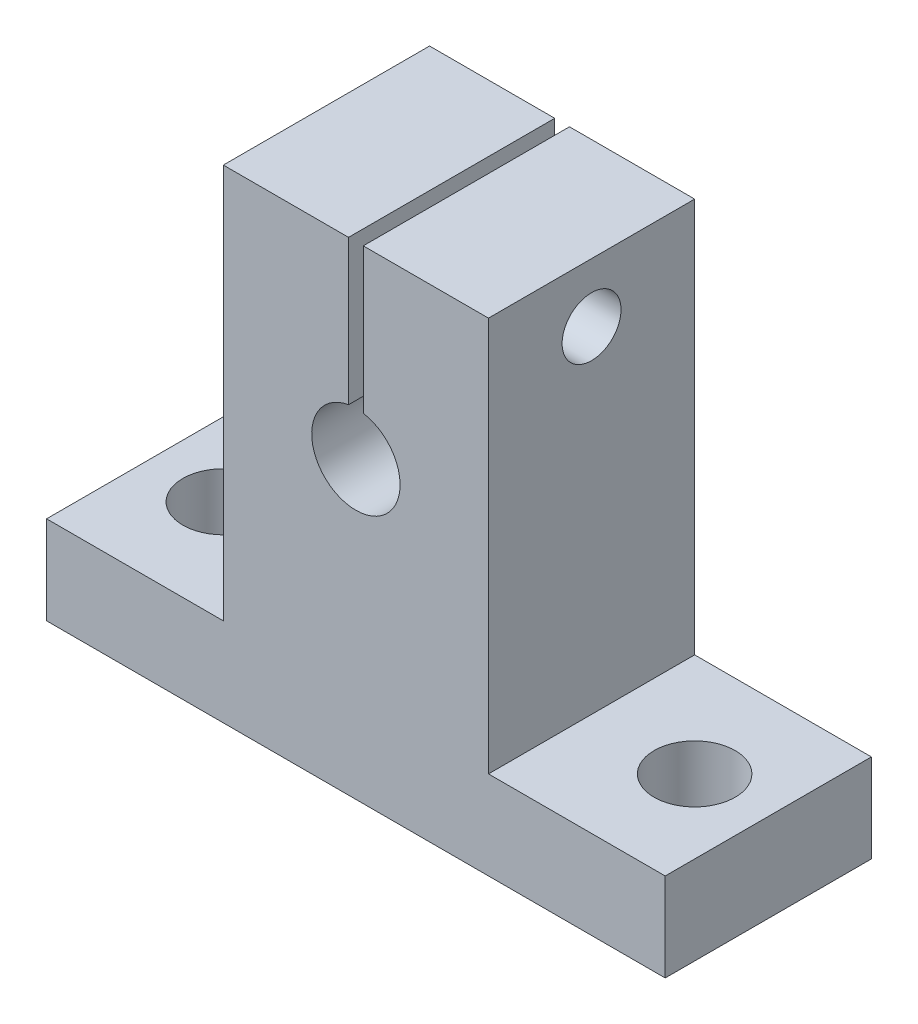
ISO-10303-21;
HEADER;
FILE_DESCRIPTION(('STEP AP214'),'2;1');
FILE_NAME('part.step','',(''),(''),'','','');
FILE_SCHEMA(('AUTOMOTIVE_DESIGN { 1 0 10303 214 1 1 1 1 }'));
ENDSEC;
DATA;
#1=APPLICATION_CONTEXT('core data for automotive mechanical design processes');
#2=APPLICATION_PROTOCOL_DEFINITION('international standard','automotive_design',2000,#1);
#3=PRODUCT_CONTEXT('',#1,'mechanical');
#4=PRODUCT('Part','Part','',(#3));
#5=PRODUCT_RELATED_PRODUCT_CATEGORY('part','',(#4));
#6=PRODUCT_DEFINITION_FORMATION('','',#4);
#7=PRODUCT_DEFINITION_CONTEXT('part definition',#1,'design');
#8=PRODUCT_DEFINITION('design','',#6,#7);
#9=PRODUCT_DEFINITION_SHAPE('','',#8);
#10=(LENGTH_UNIT() NAMED_UNIT(*) SI_UNIT(.MILLI.,.METRE.));
#11=(NAMED_UNIT(*) PLANE_ANGLE_UNIT() SI_UNIT($,.RADIAN.));
#12=(NAMED_UNIT(*) SI_UNIT($,.STERADIAN.) SOLID_ANGLE_UNIT());
#13=UNCERTAINTY_MEASURE_WITH_UNIT(LENGTH_MEASURE(1.E-05),#10,'distance_accuracy_value','');
#14=(GEOMETRIC_REPRESENTATION_CONTEXT(3) GLOBAL_UNCERTAINTY_ASSIGNED_CONTEXT((#13)) GLOBAL_UNIT_ASSIGNED_CONTEXT((#10,
#11,#12)) REPRESENTATION_CONTEXT('',''));
#15=CARTESIAN_POINT('',(0.,0.,0.));
#16=DIRECTION('',(0.,0.,1.));
#17=DIRECTION('',(1.,0.,0.));
#18=AXIS2_PLACEMENT_3D('',#15,#16,#17);
#19=CARTESIAN_POINT('',(-22.,28.8,7.));
#20=DIRECTION('',(1.,0.,0.));
#21=DIRECTION('',(0.,0.,-1.));
#22=AXIS2_PLACEMENT_3D('',#19,#20,#21);
#23=CYLINDRICAL_SURFACE('',#22,2.);
#24=CARTESIAN_POINT('',(0.5,28.8,7.));
#25=DIRECTION('',(1.,0.,0.));
#26=DIRECTION('',(0.,0.,-1.));
#27=AXIS2_PLACEMENT_3D('',#24,#25,#26);
#28=CIRCLE('',#27,2.);
#29=CARTESIAN_POINT('',(0.5,28.8,5.));
#30=VERTEX_POINT('',#29);
#31=EDGE_CURVE('E114',#30,#30,#28,.T.);
#32=ORIENTED_EDGE('',*,*,#31,.F.);
#33=EDGE_LOOP('',(#32));
#34=FACE_BOUND('',#33,.T.);
#35=CARTESIAN_POINT('',(9.00000000000001,28.8,7.));
#36=DIRECTION('',(1.,0.,0.));
#37=DIRECTION('',(0.,0.,-1.));
#38=AXIS2_PLACEMENT_3D('',#35,#36,#37);
#39=CIRCLE('',#38,2.);
#40=CARTESIAN_POINT('',(9.00000000000001,28.8,5.));
#41=VERTEX_POINT('',#40);
#42=EDGE_CURVE('E181',#41,#41,#39,.T.);
#43=ORIENTED_EDGE('',*,*,#42,.T.);
#44=EDGE_LOOP('',(#43));
#45=FACE_BOUND('',#44,.T.);
#46=ADVANCED_FACE('F17',(#34,#45),#23,.F.);
#47=CARTESIAN_POINT('',(16.,-16.,7.));
#48=DIRECTION('',(0.,1.,0.));
#49=DIRECTION('',(-1.,0.,0.));
#50=AXIS2_PLACEMENT_3D('',#47,#48,#49);
#51=CYLINDRICAL_SURFACE('',#50,2.75);
#52=CARTESIAN_POINT('',(16.,0.,7.));
#53=DIRECTION('',(0.,1.,0.));
#54=DIRECTION('',(-1.,0.,0.));
#55=AXIS2_PLACEMENT_3D('',#52,#53,#54);
#56=CIRCLE('',#55,2.75);
#57=CARTESIAN_POINT('',(13.25,0.,7.));
#58=VERTEX_POINT('',#57);
#59=EDGE_CURVE('E200',#58,#58,#56,.F.);
#60=ORIENTED_EDGE('',*,*,#59,.T.);
#61=EDGE_LOOP('',(#60));
#62=FACE_BOUND('',#61,.T.);
#63=CARTESIAN_POINT('',(16.,6.00000000000001,7.));
#64=DIRECTION('',(0.,1.,0.));
#65=DIRECTION('',(-1.,0.,0.));
#66=AXIS2_PLACEMENT_3D('',#63,#64,#65);
#67=CIRCLE('',#66,2.75);
#68=CARTESIAN_POINT('',(13.25,6.,7.));
#69=VERTEX_POINT('',#68);
#70=EDGE_CURVE('E175',#69,#69,#67,.T.);
#71=ORIENTED_EDGE('',*,*,#70,.T.);
#72=EDGE_LOOP('',(#71));
#73=FACE_BOUND('',#72,.T.);
#74=ADVANCED_FACE('F467',(#62,#73),#51,.F.);
#75=CARTESIAN_POINT('',(-16.,-16.,6.99999999999999));
#76=DIRECTION('',(0.,1.,0.));
#77=DIRECTION('',(-1.,0.,0.));
#78=AXIS2_PLACEMENT_3D('',#75,#76,#77);
#79=CYLINDRICAL_SURFACE('',#78,2.75);
#80=CARTESIAN_POINT('',(-16.,0.,6.99999999999999));
#81=DIRECTION('',(0.,1.,0.));
#82=DIRECTION('',(-1.,0.,0.));
#83=AXIS2_PLACEMENT_3D('',#80,#81,#82);
#84=CIRCLE('',#83,2.75);
#85=CARTESIAN_POINT('',(-18.75,0.,6.99999999999999));
#86=VERTEX_POINT('',#85);
#87=EDGE_CURVE('E164',#86,#86,#84,.F.);
#88=ORIENTED_EDGE('',*,*,#87,.T.);
#89=EDGE_LOOP('',(#88));
#90=FACE_BOUND('',#89,.T.);
#91=CARTESIAN_POINT('',(-16.,6.,6.99999999999999));
#92=DIRECTION('',(0.,1.,0.));
#93=DIRECTION('',(-1.,0.,0.));
#94=AXIS2_PLACEMENT_3D('',#91,#92,#93);
#95=CIRCLE('',#94,2.75);
#96=CARTESIAN_POINT('',(-18.75,6.,6.99999999999999));
#97=VERTEX_POINT('',#96);
#98=EDGE_CURVE('E153',#97,#97,#95,.T.);
#99=ORIENTED_EDGE('',*,*,#98,.T.);
#100=EDGE_LOOP('',(#99));
#101=FACE_BOUND('',#100,.T.);
#102=ADVANCED_FACE('F458',(#90,#101),#79,.F.);
#103=CARTESIAN_POINT('',(-22.,28.8,7.));
#104=DIRECTION('',(1.,0.,0.));
#105=DIRECTION('',(0.,0.,-1.));
#106=AXIS2_PLACEMENT_3D('',#103,#104,#105);
#107=CYLINDRICAL_SURFACE('',#106,2.);
#108=CARTESIAN_POINT('',(-0.5,28.8,7.));
#109=DIRECTION('',(1.,0.,0.));
#110=DIRECTION('',(0.,0.,-1.));
#111=AXIS2_PLACEMENT_3D('',#108,#109,#110);
#112=CIRCLE('',#111,2.);
#113=CARTESIAN_POINT('',(-0.5,28.8,5.));
#114=VERTEX_POINT('',#113);
#115=EDGE_CURVE('E136',#114,#114,#112,.T.);
#116=ORIENTED_EDGE('',*,*,#115,.T.);
#117=EDGE_LOOP('',(#116));
#118=FACE_BOUND('',#117,.T.);
#119=CARTESIAN_POINT('',(-9.00000000000001,28.8,7.));
#120=DIRECTION('',(1.,0.,0.));
#121=DIRECTION('',(0.,0.,-1.));
#122=AXIS2_PLACEMENT_3D('',#119,#120,#121);
#123=CIRCLE('',#122,2.);
#124=CARTESIAN_POINT('',(-9.00000000000001,28.8,5.));
#125=VERTEX_POINT('',#124);
#126=EDGE_CURVE('E147',#125,#125,#123,.F.);
#127=ORIENTED_EDGE('',*,*,#126,.T.);
#128=EDGE_LOOP('',(#127));
#129=FACE_BOUND('',#128,.T.);
#130=ADVANCED_FACE('F450',(#118,#129),#107,.F.);
#131=CARTESIAN_POINT('',(0.,0.,14.));
#132=DIRECTION('',(0.,0.,-1.));
#133=DIRECTION('',(-1.,0.,0.));
#134=AXIS2_PLACEMENT_3D('',#131,#132,#133);
#135=PLANE('',#134);
#136=CARTESIAN_POINT('',(0.,20.,14.));
#137=DIRECTION('',(0.,0.,-1.));
#138=DIRECTION('',(-1.,0.,0.));
#139=AXIS2_PLACEMENT_3D('',#136,#137,#138);
#140=CIRCLE('',#139,3.);
#141=CARTESIAN_POINT('',(0.500000000000001,22.9580398915498,14.));
#142=VERTEX_POINT('',#141);
#143=CARTESIAN_POINT('',(-0.499999999999999,22.9580398915498,14.));
#144=VERTEX_POINT('',#143);
#145=EDGE_CURVE('E20',#142,#144,#140,.T.);
#146=ORIENTED_EDGE('',*,*,#145,.T.);
#147=DIRECTION('',(0.,-1.,0.));
#148=VECTOR('',#147,1.);
#149=CARTESIAN_POINT('',(-0.5,32.8,14.));
#150=LINE('',#149,#148);
#151=CARTESIAN_POINT('',(-0.5,32.8,14.));
#152=VERTEX_POINT('',#151);
#153=EDGE_CURVE('E140',#144,#152,#150,.F.);
#154=ORIENTED_EDGE('',*,*,#153,.T.);
#155=DIRECTION('',(1.,0.,0.));
#156=VECTOR('',#155,1.);
#157=CARTESIAN_POINT('',(-9.00000000000001,32.8,14.));
#158=LINE('',#157,#156);
#159=CARTESIAN_POINT('',(-9.00000000000001,32.8,14.));
#160=VERTEX_POINT('',#159);
#161=EDGE_CURVE('E133',#152,#160,#158,.F.);
#162=ORIENTED_EDGE('',*,*,#161,.T.);
#163=DIRECTION('',(0.,1.,0.));
#164=VECTOR('',#163,1.);
#165=CARTESIAN_POINT('',(-9.,6.,14.));
#166=LINE('',#165,#164);
#167=CARTESIAN_POINT('',(-9.,6.,14.));
#168=VERTEX_POINT('',#167);
#169=EDGE_CURVE('E144',#160,#168,#166,.F.);
#170=ORIENTED_EDGE('',*,*,#169,.T.);
#171=DIRECTION('',(1.,0.,0.));
#172=VECTOR('',#171,1.);
#173=CARTESIAN_POINT('',(-21.,6.,14.));
#174=LINE('',#173,#172);
#175=CARTESIAN_POINT('',(-21.,6.,14.));
#176=VERTEX_POINT('',#175);
#177=EDGE_CURVE('E150',#168,#176,#174,.F.);
#178=ORIENTED_EDGE('',*,*,#177,.T.);
#179=DIRECTION('',(0.,1.,0.));
#180=VECTOR('',#179,1.);
#181=CARTESIAN_POINT('',(-21.,0.,14.));
#182=LINE('',#181,#180);
#183=CARTESIAN_POINT('',(-21.,0.,14.));
#184=VERTEX_POINT('',#183);
#185=EDGE_CURVE('E156',#176,#184,#182,.F.);
#186=ORIENTED_EDGE('',*,*,#185,.T.);
#187=DIRECTION('',(-1.,0.,0.));
#188=VECTOR('',#187,1.);
#189=CARTESIAN_POINT('',(-21.,0.,14.));
#190=LINE('',#189,#188);
#191=CARTESIAN_POINT('',(21.,0.,14.));
#192=VERTEX_POINT('',#191);
#193=EDGE_CURVE('E162',#184,#192,#190,.F.);
#194=ORIENTED_EDGE('',*,*,#193,.T.);
#195=DIRECTION('',(0.,1.,0.));
#196=VECTOR('',#195,1.);
#197=CARTESIAN_POINT('',(21.,0.,14.));
#198=LINE('',#197,#196);
#199=CARTESIAN_POINT('',(21.,6.00000000000001,14.));
#200=VERTEX_POINT('',#199);
#201=EDGE_CURVE('E167',#192,#200,#198,.T.);
#202=ORIENTED_EDGE('',*,*,#201,.T.);
#203=DIRECTION('',(1.,0.,0.));
#204=VECTOR('',#203,1.);
#205=CARTESIAN_POINT('',(9.,6.,14.));
#206=LINE('',#205,#204);
#207=CARTESIAN_POINT('',(9.,6.,14.));
#208=VERTEX_POINT('',#207);
#209=EDGE_CURVE('E173',#200,#208,#206,.F.);
#210=ORIENTED_EDGE('',*,*,#209,.T.);
#211=DIRECTION('',(0.,1.,0.));
#212=VECTOR('',#211,1.);
#213=CARTESIAN_POINT('',(9.,6.,14.));
#214=LINE('',#213,#212);
#215=CARTESIAN_POINT('',(9.,32.8,14.));
#216=VERTEX_POINT('',#215);
#217=EDGE_CURVE('E178',#208,#216,#214,.T.);
#218=ORIENTED_EDGE('',*,*,#217,.T.);
#219=DIRECTION('',(1.,0.,0.));
#220=VECTOR('',#219,1.);
#221=CARTESIAN_POINT('',(-9.00000000000001,32.8,14.));
#222=LINE('',#221,#220);
#223=CARTESIAN_POINT('',(0.5,32.8,14.));
#224=VERTEX_POINT('',#223);
#225=EDGE_CURVE('E119',#216,#224,#222,.F.);
#226=ORIENTED_EDGE('',*,*,#225,.T.);
#227=DIRECTION('',(0.,-1.,0.));
#228=VECTOR('',#227,1.);
#229=CARTESIAN_POINT('',(0.5,32.8,14.));
#230=LINE('',#229,#228);
#231=EDGE_CURVE('E116',#142,#224,#230,.F.);
#232=ORIENTED_EDGE('',*,*,#231,.F.);
#233=EDGE_LOOP('',(#146,#154,#162,#170,#178,#186,#194,#202,#210,#218,#226,#232));
#234=FACE_BOUND('',#233,.T.);
#235=ADVANCED_FACE('F117',(#234),#135,.F.);
#236=CARTESIAN_POINT('',(0.,20.,14.));
#237=DIRECTION('',(0.,0.,-1.));
#238=DIRECTION('',(-1.,0.,0.));
#239=AXIS2_PLACEMENT_3D('',#236,#237,#238);
#240=CYLINDRICAL_SURFACE('',#239,3.);
#241=ORIENTED_EDGE('',*,*,#145,.F.);
#242=DIRECTION('',(0.,0.,1.));
#243=VECTOR('',#242,1.);
#244=CARTESIAN_POINT('',(0.500000000000001,22.9580398915498,-5.));
#245=LINE('',#244,#243);
#246=CARTESIAN_POINT('',(0.500000000000001,22.9580398915498,0.));
#247=VERTEX_POINT('',#246);
#248=EDGE_CURVE('E108',#247,#142,#245,.T.);
#249=ORIENTED_EDGE('',*,*,#248,.F.);
#250=CARTESIAN_POINT('',(0.,20.,0.));
#251=DIRECTION('',(0.,0.,-1.));
#252=DIRECTION('',(-1.,0.,0.));
#253=AXIS2_PLACEMENT_3D('',#250,#251,#252);
#254=CIRCLE('',#253,3.);
#255=CARTESIAN_POINT('',(-0.499999999999999,22.9580398915498,0.));
#256=VERTEX_POINT('',#255);
#257=EDGE_CURVE('E190',#256,#247,#254,.F.);
#258=ORIENTED_EDGE('',*,*,#257,.F.);
#259=DIRECTION('',(0.,0.,1.));
#260=VECTOR('',#259,1.);
#261=CARTESIAN_POINT('',(-0.499999999999999,22.9580398915498,-5.));
#262=LINE('',#261,#260);
#263=EDGE_CURVE('E111',#256,#144,#262,.T.);
#264=ORIENTED_EDGE('',*,*,#263,.T.);
#265=EDGE_LOOP('',(#241,#249,#258,#264));
#266=FACE_BOUND('',#265,.T.);
#267=ADVANCED_FACE('F106',(#266),#240,.F.);
#268=CARTESIAN_POINT('',(0.5,32.8,-5.));
#269=DIRECTION('',(-1.,0.,0.));
#270=DIRECTION('',(0.,-1.,0.));
#271=AXIS2_PLACEMENT_3D('',#268,#269,#270);
#272=PLANE('',#271);
#273=DIRECTION('',(0.,0.,-1.));
#274=VECTOR('',#273,1.);
#275=CARTESIAN_POINT('',(0.5,32.8,14.));
#276=LINE('',#275,#274);
#277=CARTESIAN_POINT('',(0.500000000000001,32.8,0.));
#278=VERTEX_POINT('',#277);
#279=EDGE_CURVE('E185',#224,#278,#276,.T.);
#280=ORIENTED_EDGE('',*,*,#279,.T.);
#281=DIRECTION('',(0.,1.,0.));
#282=VECTOR('',#281,1.);
#283=CARTESIAN_POINT('',(0.500000000000001,0.,0.));
#284=LINE('',#283,#282);
#285=EDGE_CURVE('E126',#247,#278,#284,.T.);
#286=ORIENTED_EDGE('',*,*,#285,.F.);
#287=ORIENTED_EDGE('',*,*,#248,.T.);
#288=ORIENTED_EDGE('',*,*,#231,.T.);
#289=EDGE_LOOP('',(#280,#286,#287,#288));
#290=FACE_BOUND('',#289,.T.);
#291=ORIENTED_EDGE('',*,*,#31,.T.);
#292=EDGE_LOOP('',(#291));
#293=FACE_BOUND('',#292,.T.);
#294=ADVANCED_FACE('F123',(#290,#293),#272,.T.);
#295=CARTESIAN_POINT('',(-9.00000000000001,32.8,14.));
#296=DIRECTION('',(0.,-1.,0.));
#297=DIRECTION('',(0.,0.,-1.));
#298=AXIS2_PLACEMENT_3D('',#295,#296,#297);
#299=PLANE('',#298);
#300=ORIENTED_EDGE('',*,*,#225,.F.);
#301=DIRECTION('',(0.,0.,1.));
#302=VECTOR('',#301,1.);
#303=CARTESIAN_POINT('',(9.,32.8,14.));
#304=LINE('',#303,#302);
#305=CARTESIAN_POINT('',(9.,32.8,0.));
#306=VERTEX_POINT('',#305);
#307=EDGE_CURVE('E180',#216,#306,#304,.F.);
#308=ORIENTED_EDGE('',*,*,#307,.T.);
#309=DIRECTION('',(-1.,0.,0.));
#310=VECTOR('',#309,1.);
#311=CARTESIAN_POINT('',(0.,32.8,0.));
#312=LINE('',#311,#310);
#313=EDGE_CURVE('E212',#278,#306,#312,.F.);
#314=ORIENTED_EDGE('',*,*,#313,.F.);
#315=ORIENTED_EDGE('',*,*,#279,.F.);
#316=EDGE_LOOP('',(#300,#308,#314,#315));
#317=FACE_BOUND('',#316,.T.);
#318=ADVANCED_FACE('F333',(#317),#299,.F.);
#319=CARTESIAN_POINT('',(9.,6.,14.));
#320=DIRECTION('',(-1.,0.,0.));
#321=DIRECTION('',(0.,0.,1.));
#322=AXIS2_PLACEMENT_3D('',#319,#320,#321);
#323=PLANE('',#322);
#324=ORIENTED_EDGE('',*,*,#307,.F.);
#325=ORIENTED_EDGE('',*,*,#217,.F.);
#326=DIRECTION('',(0.,0.,1.));
#327=VECTOR('',#326,1.);
#328=CARTESIAN_POINT('',(9.,6.,14.));
#329=LINE('',#328,#327);
#330=CARTESIAN_POINT('',(9.,6.,0.));
#331=VERTEX_POINT('',#330);
#332=EDGE_CURVE('E170',#208,#331,#329,.F.);
#333=ORIENTED_EDGE('',*,*,#332,.T.);
#334=DIRECTION('',(0.,1.,0.));
#335=VECTOR('',#334,1.);
#336=CARTESIAN_POINT('',(9.,0.,0.));
#337=LINE('',#336,#335);
#338=EDGE_CURVE('E215',#306,#331,#337,.F.);
#339=ORIENTED_EDGE('',*,*,#338,.F.);
#340=EDGE_LOOP('',(#324,#325,#333,#339));
#341=FACE_BOUND('',#340,.T.);
#342=ORIENTED_EDGE('',*,*,#42,.F.);
#343=EDGE_LOOP('',(#342));
#344=FACE_BOUND('',#343,.T.);
#345=ADVANCED_FACE('F330',(#341,#344),#323,.F.);
#346=CARTESIAN_POINT('',(9.,6.,14.));
#347=DIRECTION('',(0.,-1.,0.));
#348=DIRECTION('',(1.,0.,0.));
#349=AXIS2_PLACEMENT_3D('',#346,#347,#348);
#350=PLANE('',#349);
#351=ORIENTED_EDGE('',*,*,#332,.F.);
#352=ORIENTED_EDGE('',*,*,#209,.F.);
#353=DIRECTION('',(0.,0.,1.));
#354=VECTOR('',#353,1.);
#355=CARTESIAN_POINT('',(21.,6.00000000000001,14.));
#356=LINE('',#355,#354);
#357=CARTESIAN_POINT('',(21.,6.,0.));
#358=VERTEX_POINT('',#357);
#359=EDGE_CURVE('E169',#200,#358,#356,.F.);
#360=ORIENTED_EDGE('',*,*,#359,.T.);
#361=DIRECTION('',(-1.,0.,0.));
#362=VECTOR('',#361,1.);
#363=CARTESIAN_POINT('',(0.,6.,0.));
#364=LINE('',#363,#362);
#365=EDGE_CURVE('E223',#331,#358,#364,.F.);
#366=ORIENTED_EDGE('',*,*,#365,.F.);
#367=EDGE_LOOP('',(#351,#352,#360,#366));
#368=FACE_BOUND('',#367,.T.);
#369=ORIENTED_EDGE('',*,*,#70,.F.);
#370=EDGE_LOOP('',(#369));
#371=FACE_BOUND('',#370,.T.);
#372=ADVANCED_FACE('F324',(#368,#371),#350,.F.);
#373=CARTESIAN_POINT('',(21.,0.,14.));
#374=DIRECTION('',(-1.,0.,0.));
#375=DIRECTION('',(0.,0.,1.));
#376=AXIS2_PLACEMENT_3D('',#373,#374,#375);
#377=PLANE('',#376);
#378=ORIENTED_EDGE('',*,*,#359,.F.);
#379=ORIENTED_EDGE('',*,*,#201,.F.);
#380=DIRECTION('',(0.,0.,1.));
#381=VECTOR('',#380,1.);
#382=CARTESIAN_POINT('',(21.,0.,14.));
#383=LINE('',#382,#381);
#384=CARTESIAN_POINT('',(21.,0.,0.));
#385=VERTEX_POINT('',#384);
#386=EDGE_CURVE('E159',#192,#385,#383,.F.);
#387=ORIENTED_EDGE('',*,*,#386,.T.);
#388=DIRECTION('',(0.,1.,0.));
#389=VECTOR('',#388,1.);
#390=CARTESIAN_POINT('',(21.,0.,0.));
#391=LINE('',#390,#389);
#392=EDGE_CURVE('E231',#358,#385,#391,.F.);
#393=ORIENTED_EDGE('',*,*,#392,.F.);
#394=EDGE_LOOP('',(#378,#379,#387,#393));
#395=FACE_BOUND('',#394,.T.);
#396=ADVANCED_FACE('F319',(#395),#377,.F.);
#397=CARTESIAN_POINT('',(-21.,0.,14.));
#398=DIRECTION('',(0.,1.,0.));
#399=DIRECTION('',(-1.,0.,0.));
#400=AXIS2_PLACEMENT_3D('',#397,#398,#399);
#401=PLANE('',#400);
#402=ORIENTED_EDGE('',*,*,#386,.F.);
#403=ORIENTED_EDGE('',*,*,#193,.F.);
#404=DIRECTION('',(0.,0.,-1.));
#405=VECTOR('',#404,1.);
#406=CARTESIAN_POINT('',(-21.,0.,14.));
#407=LINE('',#406,#405);
#408=CARTESIAN_POINT('',(-21.,0.,0.));
#409=VERTEX_POINT('',#408);
#410=EDGE_CURVE('E158',#184,#409,#407,.T.);
#411=ORIENTED_EDGE('',*,*,#410,.T.);
#412=DIRECTION('',(-1.,0.,0.));
#413=VECTOR('',#412,1.);
#414=CARTESIAN_POINT('',(0.,0.,0.));
#415=LINE('',#414,#413);
#416=EDGE_CURVE('E239',#385,#409,#415,.T.);
#417=ORIENTED_EDGE('',*,*,#416,.F.);
#418=EDGE_LOOP('',(#402,#403,#411,#417));
#419=FACE_BOUND('',#418,.T.);
#420=ORIENTED_EDGE('',*,*,#87,.F.);
#421=EDGE_LOOP('',(#420));
#422=FACE_BOUND('',#421,.T.);
#423=ORIENTED_EDGE('',*,*,#59,.F.);
#424=EDGE_LOOP('',(#423));
#425=FACE_BOUND('',#424,.T.);
#426=ADVANCED_FACE('F313',(#419,#422,#425),#401,.F.);
#427=CARTESIAN_POINT('',(-21.,0.,14.));
#428=DIRECTION('',(1.,0.,0.));
#429=DIRECTION('',(0.,0.,-1.));
#430=AXIS2_PLACEMENT_3D('',#427,#428,#429);
#431=PLANE('',#430);
#432=ORIENTED_EDGE('',*,*,#410,.F.);
#433=ORIENTED_EDGE('',*,*,#185,.F.);
#434=DIRECTION('',(0.,0.,-1.));
#435=VECTOR('',#434,1.);
#436=CARTESIAN_POINT('',(-21.,6.,14.));
#437=LINE('',#436,#435);
#438=CARTESIAN_POINT('',(-21.,6.,0.));
#439=VERTEX_POINT('',#438);
#440=EDGE_CURVE('E152',#176,#439,#437,.T.);
#441=ORIENTED_EDGE('',*,*,#440,.T.);
#442=DIRECTION('',(0.,1.,0.));
#443=VECTOR('',#442,1.);
#444=CARTESIAN_POINT('',(-21.,0.,0.));
#445=LINE('',#444,#443);
#446=EDGE_CURVE('E247',#409,#439,#445,.T.);
#447=ORIENTED_EDGE('',*,*,#446,.F.);
#448=EDGE_LOOP('',(#432,#433,#441,#447));
#449=FACE_BOUND('',#448,.T.);
#450=ADVANCED_FACE('F308',(#449),#431,.F.);
#451=CARTESIAN_POINT('',(-21.,6.,14.));
#452=DIRECTION('',(0.,-1.,0.));
#453=DIRECTION('',(0.,0.,-1.));
#454=AXIS2_PLACEMENT_3D('',#451,#452,#453);
#455=PLANE('',#454);
#456=ORIENTED_EDGE('',*,*,#440,.F.);
#457=ORIENTED_EDGE('',*,*,#177,.F.);
#458=DIRECTION('',(0.,0.,1.));
#459=VECTOR('',#458,1.);
#460=CARTESIAN_POINT('',(-9.,6.,14.));
#461=LINE('',#460,#459);
#462=CARTESIAN_POINT('',(-9.,6.,0.));
#463=VERTEX_POINT('',#462);
#464=EDGE_CURVE('E146',#168,#463,#461,.F.);
#465=ORIENTED_EDGE('',*,*,#464,.T.);
#466=DIRECTION('',(-1.,0.,0.));
#467=VECTOR('',#466,1.);
#468=CARTESIAN_POINT('',(0.,6.,0.));
#469=LINE('',#468,#467);
#470=EDGE_CURVE('E255',#439,#463,#469,.F.);
#471=ORIENTED_EDGE('',*,*,#470,.F.);
#472=EDGE_LOOP('',(#456,#457,#465,#471));
#473=FACE_BOUND('',#472,.T.);
#474=ORIENTED_EDGE('',*,*,#98,.F.);
#475=EDGE_LOOP('',(#474));
#476=FACE_BOUND('',#475,.T.);
#477=ADVANCED_FACE('F302',(#473,#476),#455,.F.);
#478=CARTESIAN_POINT('',(-9.,6.,14.));
#479=DIRECTION('',(1.,0.,0.));
#480=DIRECTION('',(0.,1.,0.));
#481=AXIS2_PLACEMENT_3D('',#478,#479,#480);
#482=PLANE('',#481);
#483=ORIENTED_EDGE('',*,*,#464,.F.);
#484=ORIENTED_EDGE('',*,*,#169,.F.);
#485=DIRECTION('',(0.,0.,-1.));
#486=VECTOR('',#485,1.);
#487=CARTESIAN_POINT('',(-9.00000000000001,32.8,14.));
#488=LINE('',#487,#486);
#489=CARTESIAN_POINT('',(-9.,32.8,0.));
#490=VERTEX_POINT('',#489);
#491=EDGE_CURVE('E137',#160,#490,#488,.T.);
#492=ORIENTED_EDGE('',*,*,#491,.T.);
#493=DIRECTION('',(0.,1.,0.));
#494=VECTOR('',#493,1.);
#495=CARTESIAN_POINT('',(-9.,0.,0.));
#496=LINE('',#495,#494);
#497=EDGE_CURVE('E263',#463,#490,#496,.T.);
#498=ORIENTED_EDGE('',*,*,#497,.F.);
#499=EDGE_LOOP('',(#483,#484,#492,#498));
#500=FACE_BOUND('',#499,.T.);
#501=ORIENTED_EDGE('',*,*,#126,.F.);
#502=EDGE_LOOP('',(#501));
#503=FACE_BOUND('',#502,.T.);
#504=ADVANCED_FACE('F296',(#500,#503),#482,.F.);
#505=CARTESIAN_POINT('',(-9.00000000000001,32.8,14.));
#506=DIRECTION('',(0.,-1.,0.));
#507=DIRECTION('',(0.,0.,-1.));
#508=AXIS2_PLACEMENT_3D('',#505,#506,#507);
#509=PLANE('',#508);
#510=DIRECTION('',(0.,0.,1.));
#511=VECTOR('',#510,1.);
#512=CARTESIAN_POINT('',(-0.5,32.8,-5.));
#513=LINE('',#512,#511);
#514=CARTESIAN_POINT('',(-0.5,32.8,0.));
#515=VERTEX_POINT('',#514);
#516=EDGE_CURVE('E35',#152,#515,#513,.F.);
#517=ORIENTED_EDGE('',*,*,#516,.T.);
#518=DIRECTION('',(-1.,0.,0.));
#519=VECTOR('',#518,1.);
#520=CARTESIAN_POINT('',(0.,32.8,0.));
#521=LINE('',#520,#519);
#522=EDGE_CURVE('E26',#490,#515,#521,.F.);
#523=ORIENTED_EDGE('',*,*,#522,.F.);
#524=ORIENTED_EDGE('',*,*,#491,.F.);
#525=ORIENTED_EDGE('',*,*,#161,.F.);
#526=EDGE_LOOP('',(#517,#523,#524,#525));
#527=FACE_BOUND('',#526,.T.);
#528=ADVANCED_FACE('F292',(#527),#509,.F.);
#529=CARTESIAN_POINT('',(-0.5,32.8,-5.));
#530=DIRECTION('',(-1.,0.,0.));
#531=DIRECTION('',(0.,-1.,0.));
#532=AXIS2_PLACEMENT_3D('',#529,#530,#531);
#533=PLANE('',#532);
#534=ORIENTED_EDGE('',*,*,#516,.F.);
#535=ORIENTED_EDGE('',*,*,#153,.F.);
#536=ORIENTED_EDGE('',*,*,#263,.F.);
#537=DIRECTION('',(0.,1.,0.));
#538=VECTOR('',#537,1.);
#539=CARTESIAN_POINT('',(-0.5,0.,0.));
#540=LINE('',#539,#538);
#541=EDGE_CURVE('E11',#515,#256,#540,.F.);
#542=ORIENTED_EDGE('',*,*,#541,.F.);
#543=EDGE_LOOP('',(#534,#535,#536,#542));
#544=FACE_BOUND('',#543,.T.);
#545=ORIENTED_EDGE('',*,*,#115,.F.);
#546=EDGE_LOOP('',(#545));
#547=FACE_BOUND('',#546,.T.);
#548=ADVANCED_FACE('F289',(#544,#547),#533,.F.);
#549=CARTESIAN_POINT('',(0.,0.,0.));
#550=DIRECTION('',(0.,0.,-1.));
#551=DIRECTION('',(-1.,0.,0.));
#552=AXIS2_PLACEMENT_3D('',#549,#550,#551);
#553=PLANE('',#552);
#554=ORIENTED_EDGE('',*,*,#522,.T.);
#555=ORIENTED_EDGE('',*,*,#541,.T.);
#556=ORIENTED_EDGE('',*,*,#257,.T.);
#557=ORIENTED_EDGE('',*,*,#285,.T.);
#558=ORIENTED_EDGE('',*,*,#313,.T.);
#559=ORIENTED_EDGE('',*,*,#338,.T.);
#560=ORIENTED_EDGE('',*,*,#365,.T.);
#561=ORIENTED_EDGE('',*,*,#392,.T.);
#562=ORIENTED_EDGE('',*,*,#416,.T.);
#563=ORIENTED_EDGE('',*,*,#446,.T.);
#564=ORIENTED_EDGE('',*,*,#470,.T.);
#565=ORIENTED_EDGE('',*,*,#497,.T.);
#566=EDGE_LOOP('',(#554,#555,#556,#557,#558,#559,#560,#561,#562,#563,#564,#565));
#567=FACE_BOUND('',#566,.T.);
#568=ADVANCED_FACE('F287',(#567),#553,.T.);
#569=CLOSED_SHELL('',(#46,#74,#102,#130,#235,#267,#294,#318,#345,#372,#396,#426,#450,#477,#504,
#528,#548,#568));
#570=MANIFOLD_SOLID_BREP('B1',#569);
#571=ADVANCED_BREP_SHAPE_REPRESENTATION('',(#18,#570),#14);
#572=SHAPE_DEFINITION_REPRESENTATION(#9,#571);
ENDSEC;
END-ISO-10303-21;
